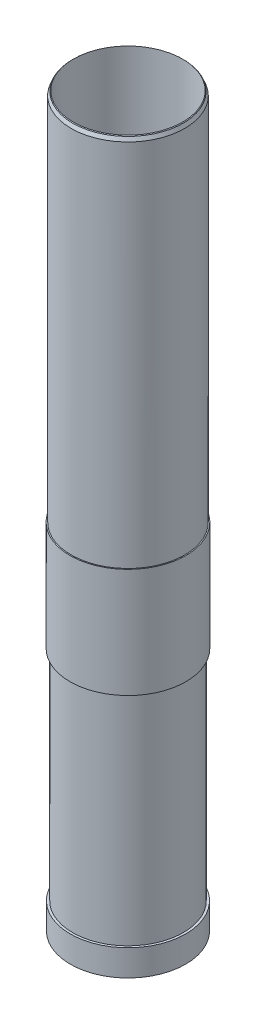
ISO-10303-21;
HEADER;
FILE_DESCRIPTION(('STEP AP214'),'2;1');
FILE_NAME('part.step','',(''),(''),'','','');
FILE_SCHEMA(('AUTOMOTIVE_DESIGN { 1 0 10303 214 1 1 1 1 }'));
ENDSEC;
DATA;
#1=APPLICATION_CONTEXT('core data for automotive mechanical design processes');
#2=APPLICATION_PROTOCOL_DEFINITION('international standard','automotive_design',2000,#1);
#3=PRODUCT_CONTEXT('',#1,'mechanical');
#4=PRODUCT('Part','Part','',(#3));
#5=PRODUCT_RELATED_PRODUCT_CATEGORY('part','',(#4));
#6=PRODUCT_DEFINITION_FORMATION('','',#4);
#7=PRODUCT_DEFINITION_CONTEXT('part definition',#1,'design');
#8=PRODUCT_DEFINITION('design','',#6,#7);
#9=PRODUCT_DEFINITION_SHAPE('','',#8);
#10=(LENGTH_UNIT() NAMED_UNIT(*) SI_UNIT(.MILLI.,.METRE.));
#11=(NAMED_UNIT(*) PLANE_ANGLE_UNIT() SI_UNIT($,.RADIAN.));
#12=(NAMED_UNIT(*) SI_UNIT($,.STERADIAN.) SOLID_ANGLE_UNIT());
#13=UNCERTAINTY_MEASURE_WITH_UNIT(LENGTH_MEASURE(1.E-05),#10,'distance_accuracy_value','');
#14=(GEOMETRIC_REPRESENTATION_CONTEXT(3) GLOBAL_UNCERTAINTY_ASSIGNED_CONTEXT((#13)) GLOBAL_UNIT_ASSIGNED_CONTEXT((#10,
#11,#12)) REPRESENTATION_CONTEXT('',''));
#15=CARTESIAN_POINT('',(0.,0.,0.));
#16=DIRECTION('',(0.,0.,1.));
#17=DIRECTION('',(1.,0.,0.));
#18=AXIS2_PLACEMENT_3D('',#15,#16,#17);
#19=CARTESIAN_POINT('',(0.,162.,0.));
#20=DIRECTION('',(0.,1.,0.));
#21=DIRECTION('',(1.,0.,0.));
#22=AXIS2_PLACEMENT_3D('',#19,#20,#21);
#23=PLANE('',#22);
#24=CARTESIAN_POINT('',(0.,162.,0.));
#25=DIRECTION('',(0.,-1.,0.));
#26=DIRECTION('',(-1.,0.,0.));
#27=AXIS2_PLACEMENT_3D('',#24,#25,#26);
#28=CIRCLE('',#27,26.);
#29=CARTESIAN_POINT('',(-26.,162.,0.));
#30=VERTEX_POINT('',#29);
#31=EDGE_CURVE('E105',#30,#30,#28,.T.);
#32=ORIENTED_EDGE('',*,*,#31,.T.);
#33=EDGE_LOOP('',(#32));
#34=FACE_BOUND('',#33,.T.);
#35=CARTESIAN_POINT('',(0.,162.,0.));
#36=DIRECTION('',(0.,1.,0.));
#37=DIRECTION('',(1.,0.,0.));
#38=AXIS2_PLACEMENT_3D('',#35,#36,#37);
#39=CIRCLE('',#38,26.5);
#40=CARTESIAN_POINT('',(-26.5,162.,0.));
#41=VERTEX_POINT('',#40);
#42=EDGE_CURVE('E28',#41,#41,#39,.T.);
#43=ORIENTED_EDGE('',*,*,#42,.T.);
#44=EDGE_LOOP('',(#43));
#45=FACE_BOUND('',#44,.T.);
#46=ADVANCED_FACE('F17',(#34,#45),#23,.T.);
#47=CARTESIAN_POINT('',(0.,-16.65,0.));
#48=DIRECTION('',(0.,1.,0.));
#49=DIRECTION('',(1.,0.,0.));
#50=AXIS2_PLACEMENT_3D('',#47,#48,#49);
#51=CYLINDRICAL_SURFACE('',#50,26.5);
#52=ORIENTED_EDGE('',*,*,#42,.F.);
#53=DIRECTION('',(0.,-1.,0.));
#54=VECTOR('',#53,1.);
#55=CARTESIAN_POINT('',(-26.5,-16.65,0.));
#56=LINE('',#55,#54);
#57=CARTESIAN_POINT('',(-26.5,112.,0.));
#58=VERTEX_POINT('',#57);
#59=EDGE_CURVE('E11',#41,#58,#56,.T.);
#60=ORIENTED_EDGE('',*,*,#59,.T.);
#61=CARTESIAN_POINT('',(0.,112.,0.));
#62=DIRECTION('',(0.,1.,0.));
#63=DIRECTION('',(1.,0.,0.));
#64=AXIS2_PLACEMENT_3D('',#61,#62,#63);
#65=CIRCLE('',#64,26.5);
#66=EDGE_CURVE('E87',#58,#58,#65,.T.);
#67=ORIENTED_EDGE('',*,*,#66,.T.);
#68=ORIENTED_EDGE('',*,*,#59,.F.);
#69=EDGE_LOOP('',(#52,#60,#67,#68));
#70=FACE_BOUND('',#69,.T.);
#71=ADVANCED_FACE('F200',(#70),#51,.T.);
#72=CARTESIAN_POINT('',(0.,112.,0.));
#73=DIRECTION('',(0.,1.,0.));
#74=DIRECTION('',(1.,0.,0.));
#75=AXIS2_PLACEMENT_3D('',#72,#73,#74);
#76=PLANE('',#75);
#77=CARTESIAN_POINT('',(0.,112.,0.));
#78=DIRECTION('',(0.,1.,0.));
#79=DIRECTION('',(1.,0.,0.));
#80=AXIS2_PLACEMENT_3D('',#77,#78,#79);
#81=CIRCLE('',#80,25.35);
#82=CARTESIAN_POINT('',(-25.35,112.,0.));
#83=VERTEX_POINT('',#82);
#84=EDGE_CURVE('E85',#83,#83,#81,.T.);
#85=ORIENTED_EDGE('',*,*,#84,.T.);
#86=EDGE_LOOP('',(#85));
#87=FACE_BOUND('',#86,.T.);
#88=ORIENTED_EDGE('',*,*,#66,.F.);
#89=EDGE_LOOP('',(#88));
#90=FACE_BOUND('',#89,.T.);
#91=ADVANCED_FACE('F196',(#87,#90),#76,.F.);
#92=CARTESIAN_POINT('',(0.,7.,0.));
#93=DIRECTION('',(0.,1.,0.));
#94=DIRECTION('',(1.,0.,0.));
#95=AXIS2_PLACEMENT_3D('',#92,#93,#94);
#96=CYLINDRICAL_SURFACE('',#95,25.35);
#97=ORIENTED_EDGE('',*,*,#84,.F.);
#98=DIRECTION('',(0.,-1.,0.));
#99=VECTOR('',#98,1.);
#100=CARTESIAN_POINT('',(-25.35,7.,0.));
#101=LINE('',#100,#99);
#102=CARTESIAN_POINT('',(-25.35,12.,0.));
#103=VERTEX_POINT('',#102);
#104=EDGE_CURVE('E80',#83,#103,#101,.T.);
#105=ORIENTED_EDGE('',*,*,#104,.T.);
#106=CARTESIAN_POINT('',(0.,12.,0.));
#107=DIRECTION('',(0.,-1.,0.));
#108=DIRECTION('',(1.,0.,0.));
#109=AXIS2_PLACEMENT_3D('',#106,#107,#108);
#110=CIRCLE('',#109,25.35);
#111=EDGE_CURVE('E83',#103,#103,#110,.T.);
#112=ORIENTED_EDGE('',*,*,#111,.F.);
#113=ORIENTED_EDGE('',*,*,#104,.F.);
#114=EDGE_LOOP('',(#97,#105,#112,#113));
#115=FACE_BOUND('',#114,.T.);
#116=ADVANCED_FACE('F82',(#115),#96,.T.);
#117=CARTESIAN_POINT('',(0.,12.,0.));
#118=DIRECTION('',(0.,1.,0.));
#119=DIRECTION('',(1.,0.,0.));
#120=AXIS2_PLACEMENT_3D('',#117,#118,#119);
#121=PLANE('',#120);
#122=ORIENTED_EDGE('',*,*,#111,.T.);
#123=EDGE_LOOP('',(#122));
#124=FACE_BOUND('',#123,.T.);
#125=CARTESIAN_POINT('',(0.,12.,0.));
#126=DIRECTION('',(0.,-1.,0.));
#127=DIRECTION('',(1.,0.,0.));
#128=AXIS2_PLACEMENT_3D('',#125,#126,#127);
#129=CIRCLE('',#128,26.4);
#130=CARTESIAN_POINT('',(26.4,12.,0.));
#131=VERTEX_POINT('',#130);
#132=EDGE_CURVE('E93',#131,#131,#129,.T.);
#133=ORIENTED_EDGE('',*,*,#132,.F.);
#134=EDGE_LOOP('',(#133));
#135=FACE_BOUND('',#134,.T.);
#136=ADVANCED_FACE('F90',(#124,#135),#121,.T.);
#137=CARTESIAN_POINT('',(0.,0.,0.));
#138=DIRECTION('',(0.,-1.,0.));
#139=DIRECTION('',(-1.,0.,0.));
#140=AXIS2_PLACEMENT_3D('',#137,#138,#139);
#141=CYLINDRICAL_SURFACE('',#140,26.4);
#142=CARTESIAN_POINT('',(0.,0.,0.));
#143=DIRECTION('',(0.,-1.,0.));
#144=DIRECTION('',(1.,0.,0.));
#145=AXIS2_PLACEMENT_3D('',#142,#143,#144);
#146=CIRCLE('',#145,26.4);
#147=CARTESIAN_POINT('',(26.4,0.,0.));
#148=VERTEX_POINT('',#147);
#149=EDGE_CURVE('E108',#148,#148,#146,.T.);
#150=ORIENTED_EDGE('',*,*,#149,.F.);
#151=DIRECTION('',(0.,1.,0.));
#152=VECTOR('',#151,1.);
#153=CARTESIAN_POINT('',(26.4,0.,0.));
#154=LINE('',#153,#152);
#155=EDGE_CURVE('E101',#148,#131,#154,.T.);
#156=ORIENTED_EDGE('',*,*,#155,.T.);
#157=ORIENTED_EDGE('',*,*,#132,.T.);
#158=ORIENTED_EDGE('',*,*,#155,.F.);
#159=EDGE_LOOP('',(#150,#156,#157,#158));
#160=FACE_BOUND('',#159,.T.);
#161=ADVANCED_FACE('F19',(#160),#141,.T.);
#162=CARTESIAN_POINT('',(0.,0.,0.));
#163=DIRECTION('',(0.,1.,0.));
#164=DIRECTION('',(1.,0.,0.));
#165=AXIS2_PLACEMENT_3D('',#162,#163,#164);
#166=PLANE('',#165);
#167=CARTESIAN_POINT('',(0.,0.,0.));
#168=DIRECTION('',(0.,1.,0.));
#169=DIRECTION('',(1.,0.,0.));
#170=AXIS2_PLACEMENT_3D('',#167,#168,#169);
#171=CIRCLE('',#170,25.);
#172=CARTESIAN_POINT('',(-25.,0.,0.));
#173=VERTEX_POINT('',#172);
#174=EDGE_CURVE('E132',#173,#173,#171,.T.);
#175=ORIENTED_EDGE('',*,*,#174,.T.);
#176=EDGE_LOOP('',(#175));
#177=FACE_BOUND('',#176,.T.);
#178=ORIENTED_EDGE('',*,*,#149,.T.);
#179=EDGE_LOOP('',(#178));
#180=FACE_BOUND('',#179,.T.);
#181=ADVANCED_FACE('F182',(#177,#180),#166,.F.);
#182=CARTESIAN_POINT('',(0.,333.,0.));
#183=DIRECTION('',(0.,1.,0.));
#184=DIRECTION('',(1.,0.,0.));
#185=AXIS2_PLACEMENT_3D('',#182,#183,#184);
#186=CYLINDRICAL_SURFACE('',#185,26.);
#187=CARTESIAN_POINT('',(0.,331.,0.));
#188=DIRECTION('',(0.,-1.,0.));
#189=DIRECTION('',(-1.,0.,0.));
#190=AXIS2_PLACEMENT_3D('',#187,#188,#189);
#191=CIRCLE('',#190,26.);
#192=CARTESIAN_POINT('',(-26.,331.,0.));
#193=VERTEX_POINT('',#192);
#194=CARTESIAN_POINT('',(0.,331.000000000005,26.0000000000112));
#195=VERTEX_POINT('',#194);
#196=EDGE_CURVE('E145',#193,#195,#191,.T.);
#197=ORIENTED_EDGE('',*,*,#196,.T.);
#198=CARTESIAN_POINT('',(0.,331.,0.));
#199=DIRECTION('',(0.,-1.,0.));
#200=DIRECTION('',(-1.,0.,0.));
#201=AXIS2_PLACEMENT_3D('',#198,#199,#200);
#202=CIRCLE('',#201,26.);
#203=EDGE_CURVE('E21',#195,#193,#202,.T.);
#204=ORIENTED_EDGE('',*,*,#203,.T.);
#205=DIRECTION('',(0.,-1.,0.));
#206=VECTOR('',#205,1.);
#207=CARTESIAN_POINT('',(-26.,333.,0.));
#208=LINE('',#207,#206);
#209=EDGE_CURVE('E140',#193,#30,#208,.T.);
#210=ORIENTED_EDGE('',*,*,#209,.T.);
#211=ORIENTED_EDGE('',*,*,#31,.F.);
#212=ORIENTED_EDGE('',*,*,#209,.F.);
#213=EDGE_LOOP('',(#197,#204,#210,#211,#212));
#214=FACE_BOUND('',#213,.T.);
#215=ADVANCED_FACE('F166',(#214),#186,.T.);
#216=CARTESIAN_POINT('',(0.,331.8535533918,0.));
#217=DIRECTION('',(0.,-1.,0.));
#218=DIRECTION('',(0.,0.,-1.));
#219=AXIS2_PLACEMENT_3D('',#216,#217,#218);
#220=CONICAL_SURFACE('',#219,25.64644660892,0.392699081698724);
#221=ORIENTED_EDGE('',*,*,#196,.F.);
#222=ORIENTED_EDGE('',*,*,#203,.F.);
#223=DIRECTION('',(0.,0.923879532511287,-0.38268343236509));
#224=VECTOR('',#223,1.);
#225=CARTESIAN_POINT('',(0.,331.8535533918,25.64644660892));
#226=LINE('',#225,#224);
#227=CARTESIAN_POINT('',(0.,332.707106781205,25.292893218815));
#228=VERTEX_POINT('',#227);
#229=EDGE_CURVE('E137',#195,#228,#226,.T.);
#230=ORIENTED_EDGE('',*,*,#229,.T.);
#231=CARTESIAN_POINT('',(0.,332.7071067812,0.));
#232=DIRECTION('',(0.,-1.,0.));
#233=DIRECTION('',(-1.,0.,-5.862546616533E-10));
#234=AXIS2_PLACEMENT_3D('',#231,#232,#233);
#235=CIRCLE('',#234,25.29289321881);
#236=EDGE_CURVE('E112',#228,#228,#235,.T.);
#237=ORIENTED_EDGE('',*,*,#236,.T.);
#238=ORIENTED_EDGE('',*,*,#229,.F.);
#239=EDGE_LOOP('',(#221,#222,#230,#237,#238));
#240=FACE_BOUND('',#239,.T.);
#241=ADVANCED_FACE('F170',(#240),#220,.T.);
#242=CARTESIAN_POINT('',(0.,332.8535534002,0.));
#243=DIRECTION('',(0.,-1.,0.));
#244=DIRECTION('',(0.,0.,-1.));
#245=AXIS2_PLACEMENT_3D('',#242,#243,#244);
#246=CONICAL_SURFACE('',#245,25.14644659982,0.785398163397448);
#247=ORIENTED_EDGE('',*,*,#236,.F.);
#248=DIRECTION('',(0.,0.707106781186548,-0.707106781186548));
#249=VECTOR('',#248,1.);
#250=CARTESIAN_POINT('',(0.,332.8535534002,25.14644659982));
#251=LINE('',#250,#249);
#252=CARTESIAN_POINT('',(0.,333.00000000001,25.00000000001));
#253=VERTEX_POINT('',#252);
#254=EDGE_CURVE('E124',#228,#253,#251,.T.);
#255=ORIENTED_EDGE('',*,*,#254,.T.);
#256=CARTESIAN_POINT('',(0.,333.,0.));
#257=DIRECTION('',(0.,1.,0.));
#258=DIRECTION('',(1.,0.,0.));
#259=AXIS2_PLACEMENT_3D('',#256,#257,#258);
#260=CIRCLE('',#259,25.);
#261=CARTESIAN_POINT('',(-25.,333.,0.));
#262=VERTEX_POINT('',#261);
#263=EDGE_CURVE('E113',#262,#253,#260,.T.);
#264=ORIENTED_EDGE('',*,*,#263,.F.);
#265=CARTESIAN_POINT('',(0.,333.,0.));
#266=DIRECTION('',(0.,1.,0.));
#267=DIRECTION('',(1.,0.,0.));
#268=AXIS2_PLACEMENT_3D('',#265,#266,#267);
#269=CIRCLE('',#268,25.);
#270=EDGE_CURVE('E109',#253,#262,#269,.T.);
#271=ORIENTED_EDGE('',*,*,#270,.F.);
#272=ORIENTED_EDGE('',*,*,#254,.F.);
#273=EDGE_LOOP('',(#247,#255,#264,#271,#272));
#274=FACE_BOUND('',#273,.T.);
#275=ADVANCED_FACE('F174',(#274),#246,.T.);
#276=CARTESIAN_POINT('',(0.,-16.65,0.));
#277=DIRECTION('',(0.,1.,0.));
#278=DIRECTION('',(1.,0.,0.));
#279=AXIS2_PLACEMENT_3D('',#276,#277,#278);
#280=CYLINDRICAL_SURFACE('',#279,25.);
#281=ORIENTED_EDGE('',*,*,#174,.F.);
#282=DIRECTION('',(0.,1.,0.));
#283=VECTOR('',#282,1.);
#284=CARTESIAN_POINT('',(-25.,-16.65,0.));
#285=LINE('',#284,#283);
#286=EDGE_CURVE('E126',#173,#262,#285,.T.);
#287=ORIENTED_EDGE('',*,*,#286,.T.);
#288=ORIENTED_EDGE('',*,*,#263,.T.);
#289=ORIENTED_EDGE('',*,*,#270,.T.);
#290=ORIENTED_EDGE('',*,*,#286,.F.);
#291=EDGE_LOOP('',(#281,#287,#288,#289,#290));
#292=FACE_BOUND('',#291,.T.);
#293=ADVANCED_FACE('F179',(#292),#280,.F.);
#294=CLOSED_SHELL('',(#46,#71,#91,#116,#136,#161,#181,#215,#241,#275,#293));
#295=MANIFOLD_SOLID_BREP('B1',#294);
#296=ADVANCED_BREP_SHAPE_REPRESENTATION('',(#18,#295),#14);
#297=SHAPE_DEFINITION_REPRESENTATION(#9,#296);
ENDSEC;
END-ISO-10303-21;
